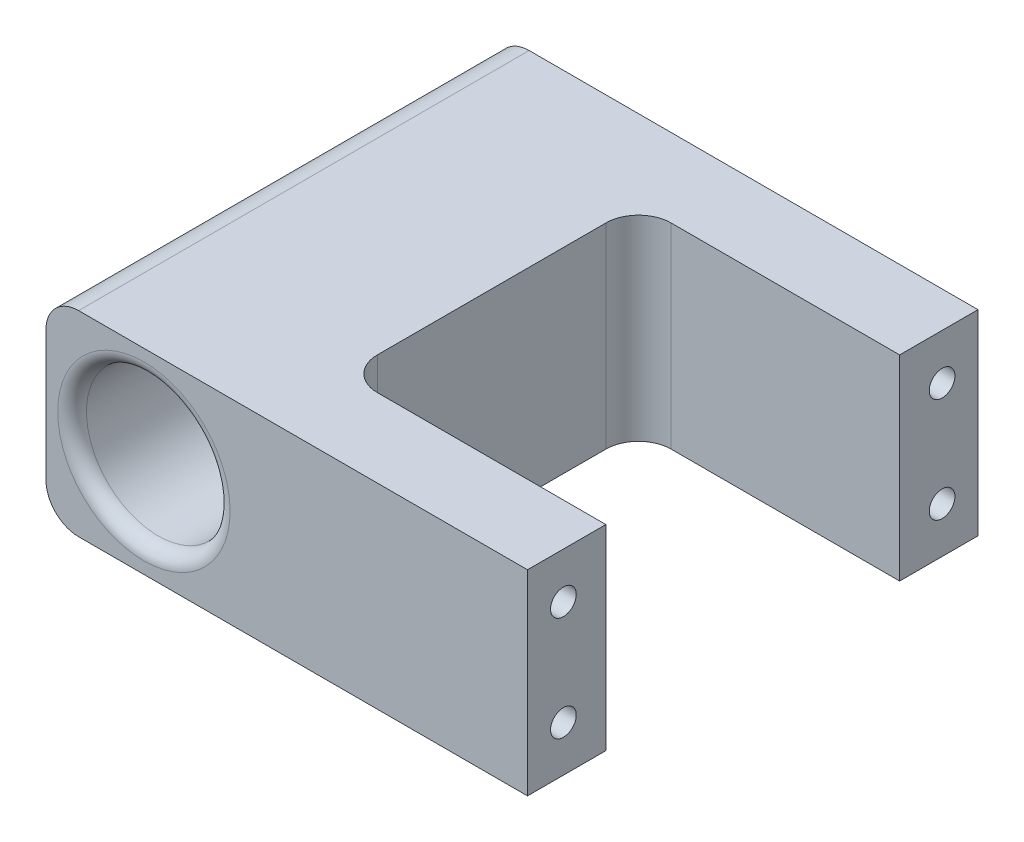
ISO-10303-21;
HEADER;
FILE_DESCRIPTION(('STEP AP214'),'2;1');
FILE_NAME('part.step','',(''),(''),'','','');
FILE_SCHEMA(('AUTOMOTIVE_DESIGN { 1 0 10303 214 1 1 1 1 }'));
ENDSEC;
DATA;
#1=APPLICATION_CONTEXT('core data for automotive mechanical design processes');
#2=APPLICATION_PROTOCOL_DEFINITION('international standard','automotive_design',2000,#1);
#3=PRODUCT_CONTEXT('',#1,'mechanical');
#4=PRODUCT('Part','Part','',(#3));
#5=PRODUCT_RELATED_PRODUCT_CATEGORY('part','',(#4));
#6=PRODUCT_DEFINITION_FORMATION('','',#4);
#7=PRODUCT_DEFINITION_CONTEXT('part definition',#1,'design');
#8=PRODUCT_DEFINITION('design','',#6,#7);
#9=PRODUCT_DEFINITION_SHAPE('','',#8);
#10=(LENGTH_UNIT() NAMED_UNIT(*) SI_UNIT(.MILLI.,.METRE.));
#11=(NAMED_UNIT(*) PLANE_ANGLE_UNIT() SI_UNIT($,.RADIAN.));
#12=(NAMED_UNIT(*) SI_UNIT($,.STERADIAN.) SOLID_ANGLE_UNIT());
#13=UNCERTAINTY_MEASURE_WITH_UNIT(LENGTH_MEASURE(1.E-05),#10,'distance_accuracy_value','');
#14=(GEOMETRIC_REPRESENTATION_CONTEXT(3) GLOBAL_UNCERTAINTY_ASSIGNED_CONTEXT((#13)) GLOBAL_UNIT_ASSIGNED_CONTEXT((#10,
#11,#12)) REPRESENTATION_CONTEXT('',''));
#15=CARTESIAN_POINT('',(0.,0.,0.));
#16=DIRECTION('',(0.,0.,1.));
#17=DIRECTION('',(1.,0.,0.));
#18=AXIS2_PLACEMENT_3D('',#15,#16,#17);
#19=CARTESIAN_POINT('',(74.609999878,-19.05,87.63));
#20=DIRECTION('',(0.,1.,0.));
#21=DIRECTION('',(-1.,0.,0.));
#22=AXIS2_PLACEMENT_3D('',#19,#20,#21);
#23=PLANE('',#22);
#24=DIRECTION('',(1.,0.,0.));
#25=VECTOR('',#24,1.);
#26=CARTESIAN_POINT('',(-19.05,-19.05,87.63));
#27=LINE('',#26,#25);
#28=CARTESIAN_POINT('',(-12.7,-19.05,87.63));
#29=VERTEX_POINT('',#28);
#30=CARTESIAN_POINT('',(74.609999878,-19.05,87.63));
#31=VERTEX_POINT('',#30);
#32=EDGE_CURVE('E177',#29,#31,#27,.T.);
#33=ORIENTED_EDGE('',*,*,#32,.F.);
#34=DIRECTION('',(0.,0.,-1.));
#35=VECTOR('',#34,1.);
#36=CARTESIAN_POINT('',(-12.7,-19.05,87.63));
#37=LINE('',#36,#35);
#38=CARTESIAN_POINT('',(-12.7,-19.05,0.));
#39=VERTEX_POINT('',#38);
#40=EDGE_CURVE('E214',#29,#39,#37,.T.);
#41=ORIENTED_EDGE('',*,*,#40,.T.);
#42=DIRECTION('',(1.,0.,0.));
#43=VECTOR('',#42,1.);
#44=CARTESIAN_POINT('',(74.609999878,-19.05,0.));
#45=LINE('',#44,#43);
#46=CARTESIAN_POINT('',(74.609999878,-19.05,0.));
#47=VERTEX_POINT('',#46);
#48=EDGE_CURVE('E243',#39,#47,#45,.T.);
#49=ORIENTED_EDGE('',*,*,#48,.T.);
#50=DIRECTION('',(0.,0.,-1.));
#51=VECTOR('',#50,1.);
#52=CARTESIAN_POINT('',(74.609999878,-19.05,87.63));
#53=LINE('',#52,#51);
#54=CARTESIAN_POINT('',(74.609999878,-19.05,15.24));
#55=VERTEX_POINT('',#54);
#56=EDGE_CURVE('E175',#55,#47,#53,.T.);
#57=ORIENTED_EDGE('',*,*,#56,.F.);
#58=DIRECTION('',(1.,0.,0.));
#59=VECTOR('',#58,1.);
#60=CARTESIAN_POINT('',(23.809999878,-19.05,15.24));
#61=LINE('',#60,#59);
#62=CARTESIAN_POINT('',(30.159999878,-19.05,15.24));
#63=VERTEX_POINT('',#62);
#64=EDGE_CURVE('E156',#63,#55,#61,.T.);
#65=ORIENTED_EDGE('',*,*,#64,.F.);
#66=CARTESIAN_POINT('',(30.159999878,-19.05,21.59));
#67=DIRECTION('',(0.,1.,0.));
#68=DIRECTION('',(-1.,0.,0.));
#69=AXIS2_PLACEMENT_3D('',#66,#67,#68);
#70=CIRCLE('',#69,6.35);
#71=CARTESIAN_POINT('',(23.809999878,-19.05,21.59));
#72=VERTEX_POINT('',#71);
#73=EDGE_CURVE('E207',#63,#72,#70,.T.);
#74=ORIENTED_EDGE('',*,*,#73,.T.);
#75=DIRECTION('',(0.,0.,1.));
#76=VECTOR('',#75,1.);
#77=CARTESIAN_POINT('',(23.809999878,-19.05,15.24));
#78=LINE('',#77,#76);
#79=CARTESIAN_POINT('',(23.809999878,-19.05,66.04));
#80=VERTEX_POINT('',#79);
#81=EDGE_CURVE('E281',#72,#80,#78,.T.);
#82=ORIENTED_EDGE('',*,*,#81,.T.);
#83=CARTESIAN_POINT('',(30.159999878,-19.05,66.04));
#84=DIRECTION('',(0.,1.,0.));
#85=DIRECTION('',(-1.,0.,0.));
#86=AXIS2_PLACEMENT_3D('',#83,#84,#85);
#87=CIRCLE('',#86,6.35);
#88=CARTESIAN_POINT('',(30.159999878,-19.05,72.39));
#89=VERTEX_POINT('',#88);
#90=EDGE_CURVE('E212',#80,#89,#87,.T.);
#91=ORIENTED_EDGE('',*,*,#90,.T.);
#92=DIRECTION('',(1.,0.,0.));
#93=VECTOR('',#92,1.);
#94=CARTESIAN_POINT('',(23.809999878,-19.05,72.39));
#95=LINE('',#94,#93);
#96=CARTESIAN_POINT('',(74.609999878,-19.05,72.39));
#97=VERTEX_POINT('',#96);
#98=EDGE_CURVE('E277',#89,#97,#95,.T.);
#99=ORIENTED_EDGE('',*,*,#98,.T.);
#100=EDGE_CURVE('E183',#31,#97,#53,.T.);
#101=ORIENTED_EDGE('',*,*,#100,.F.);
#102=EDGE_LOOP('',(#33,#41,#49,#57,#65,#74,#82,#91,#99,#101));
#103=FACE_BOUND('',#102,.T.);
#104=ADVANCED_FACE('F43',(#103),#23,.F.);
#105=CARTESIAN_POINT('',(74.609999878,19.05,87.63));
#106=DIRECTION('',(-1.,0.,0.));
#107=DIRECTION('',(0.,0.,1.));
#108=AXIS2_PLACEMENT_3D('',#105,#106,#107);
#109=PLANE('',#108);
#110=CARTESIAN_POINT('',(74.609999878,-10.16,6.985));
#111=DIRECTION('',(1.,0.,0.));
#112=DIRECTION('',(0.,0.,-1.));
#113=AXIS2_PLACEMENT_3D('',#110,#111,#112);
#114=CIRCLE('',#113,2.5);
#115=CARTESIAN_POINT('',(74.609999878,-10.16,4.48500000000001));
#116=VERTEX_POINT('',#115);
#117=EDGE_CURVE('E268',#116,#116,#114,.T.);
#118=ORIENTED_EDGE('',*,*,#117,.F.);
#119=EDGE_LOOP('',(#118));
#120=FACE_BOUND('',#119,.T.);
#121=CARTESIAN_POINT('',(74.609999878,10.16,6.985));
#122=DIRECTION('',(1.,0.,0.));
#123=DIRECTION('',(0.,0.,-1.));
#124=AXIS2_PLACEMENT_3D('',#121,#122,#123);
#125=CIRCLE('',#124,2.5);
#126=CARTESIAN_POINT('',(74.609999878,10.16,4.48500000000001));
#127=VERTEX_POINT('',#126);
#128=EDGE_CURVE('E155',#127,#127,#125,.T.);
#129=ORIENTED_EDGE('',*,*,#128,.F.);
#130=EDGE_LOOP('',(#129));
#131=FACE_BOUND('',#130,.T.);
#132=DIRECTION('',(0.,-1.,0.));
#133=VECTOR('',#132,1.);
#134=CARTESIAN_POINT('',(74.609999878,19.05,15.24));
#135=LINE('',#134,#133);
#136=CARTESIAN_POINT('',(74.609999878,19.05,15.24));
#137=VERTEX_POINT('',#136);
#138=EDGE_CURVE('E159',#137,#55,#135,.T.);
#139=ORIENTED_EDGE('',*,*,#138,.T.);
#140=ORIENTED_EDGE('',*,*,#56,.T.);
#141=DIRECTION('',(0.,1.,0.));
#142=VECTOR('',#141,1.);
#143=CARTESIAN_POINT('',(74.609999878,19.05,0.));
#144=LINE('',#143,#142);
#145=CARTESIAN_POINT('',(74.609999878,19.05,0.));
#146=VERTEX_POINT('',#145);
#147=EDGE_CURVE('E169',#47,#146,#144,.T.);
#148=ORIENTED_EDGE('',*,*,#147,.T.);
#149=DIRECTION('',(0.,0.,-1.));
#150=VECTOR('',#149,1.);
#151=CARTESIAN_POINT('',(74.609999878,19.05,87.63));
#152=LINE('',#151,#150);
#153=EDGE_CURVE('E147',#137,#146,#152,.T.);
#154=ORIENTED_EDGE('',*,*,#153,.F.);
#155=EDGE_LOOP('',(#139,#140,#148,#154));
#156=FACE_BOUND('',#155,.T.);
#157=ADVANCED_FACE('F167',(#120,#131,#156),#109,.F.);
#158=CARTESIAN_POINT('',(74.609999878,-10.16,80.645));
#159=DIRECTION('',(1.,0.,0.));
#160=DIRECTION('',(0.,0.,-1.));
#161=AXIS2_PLACEMENT_3D('',#158,#159,#160);
#162=CIRCLE('',#161,2.5);
#163=CARTESIAN_POINT('',(74.609999878,-10.16,78.145));
#164=VERTEX_POINT('',#163);
#165=EDGE_CURVE('E250',#164,#164,#162,.T.);
#166=ORIENTED_EDGE('',*,*,#165,.F.);
#167=EDGE_LOOP('',(#166));
#168=FACE_BOUND('',#167,.T.);
#169=CARTESIAN_POINT('',(74.609999878,10.16,80.645));
#170=DIRECTION('',(1.,0.,0.));
#171=DIRECTION('',(0.,0.,-1.));
#172=AXIS2_PLACEMENT_3D('',#169,#170,#171);
#173=CIRCLE('',#172,2.5);
#174=CARTESIAN_POINT('',(74.609999878,10.16,78.145));
#175=VERTEX_POINT('',#174);
#176=EDGE_CURVE('E262',#175,#175,#173,.T.);
#177=ORIENTED_EDGE('',*,*,#176,.F.);
#178=EDGE_LOOP('',(#177));
#179=FACE_BOUND('',#178,.T.);
#180=DIRECTION('',(0.,1.,0.));
#181=VECTOR('',#180,1.);
#182=CARTESIAN_POINT('',(74.609999878,-19.05,72.39));
#183=LINE('',#182,#181);
#184=CARTESIAN_POINT('',(74.609999878,19.05,72.39));
#185=VERTEX_POINT('',#184);
#186=EDGE_CURVE('E165',#97,#185,#183,.T.);
#187=ORIENTED_EDGE('',*,*,#186,.T.);
#188=CARTESIAN_POINT('',(74.609999878,19.05,87.63));
#189=VERTEX_POINT('',#188);
#190=EDGE_CURVE('E171',#189,#185,#152,.T.);
#191=ORIENTED_EDGE('',*,*,#190,.F.);
#192=DIRECTION('',(0.,1.,0.));
#193=VECTOR('',#192,1.);
#194=CARTESIAN_POINT('',(74.609999878,19.05,87.63));
#195=LINE('',#194,#193);
#196=EDGE_CURVE('E172',#31,#189,#195,.T.);
#197=ORIENTED_EDGE('',*,*,#196,.F.);
#198=ORIENTED_EDGE('',*,*,#100,.T.);
#199=EDGE_LOOP('',(#187,#191,#197,#198));
#200=FACE_BOUND('',#199,.T.);
#201=ADVANCED_FACE('F308',(#168,#179,#200),#109,.F.);
#202=CARTESIAN_POINT('',(0.,19.05,87.63));
#203=DIRECTION('',(0.,-1.,0.));
#204=DIRECTION('',(1.,0.,0.));
#205=AXIS2_PLACEMENT_3D('',#202,#203,#204);
#206=PLANE('',#205);
#207=DIRECTION('',(-1.,0.,0.));
#208=VECTOR('',#207,1.);
#209=CARTESIAN_POINT('',(0.,19.05,0.));
#210=LINE('',#209,#208);
#211=CARTESIAN_POINT('',(-12.7,19.05,0.));
#212=VERTEX_POINT('',#211);
#213=EDGE_CURVE('E181',#146,#212,#210,.T.);
#214=ORIENTED_EDGE('',*,*,#213,.T.);
#215=DIRECTION('',(0.,0.,-1.));
#216=VECTOR('',#215,1.);
#217=CARTESIAN_POINT('',(-12.7,19.05,87.63));
#218=LINE('',#217,#216);
#219=CARTESIAN_POINT('',(-12.7,19.05,87.63));
#220=VERTEX_POINT('',#219);
#221=EDGE_CURVE('E11',#212,#220,#218,.F.);
#222=ORIENTED_EDGE('',*,*,#221,.T.);
#223=DIRECTION('',(-1.,0.,0.));
#224=VECTOR('',#223,1.);
#225=CARTESIAN_POINT('',(0.,19.05,87.63));
#226=LINE('',#225,#224);
#227=EDGE_CURVE('E252',#189,#220,#226,.T.);
#228=ORIENTED_EDGE('',*,*,#227,.F.);
#229=ORIENTED_EDGE('',*,*,#190,.T.);
#230=DIRECTION('',(1.,0.,0.));
#231=VECTOR('',#230,1.);
#232=CARTESIAN_POINT('',(23.809999878,19.05,72.39));
#233=LINE('',#232,#231);
#234=CARTESIAN_POINT('',(30.159999878,19.05,72.39));
#235=VERTEX_POINT('',#234);
#236=EDGE_CURVE('E279',#235,#185,#233,.T.);
#237=ORIENTED_EDGE('',*,*,#236,.F.);
#238=CARTESIAN_POINT('',(30.159999878,19.05,66.04));
#239=DIRECTION('',(0.,-1.,0.));
#240=DIRECTION('',(1.,0.,0.));
#241=AXIS2_PLACEMENT_3D('',#238,#239,#240);
#242=CIRCLE('',#241,6.35);
#243=CARTESIAN_POINT('',(23.809999878,19.05,66.04));
#244=VERTEX_POINT('',#243);
#245=EDGE_CURVE('E210',#235,#244,#242,.T.);
#246=ORIENTED_EDGE('',*,*,#245,.T.);
#247=DIRECTION('',(0.,0.,-1.));
#248=VECTOR('',#247,1.);
#249=CARTESIAN_POINT('',(23.809999878,19.05,72.39));
#250=LINE('',#249,#248);
#251=CARTESIAN_POINT('',(23.809999878,19.05,21.59));
#252=VERTEX_POINT('',#251);
#253=EDGE_CURVE('E283',#244,#252,#250,.T.);
#254=ORIENTED_EDGE('',*,*,#253,.T.);
#255=CARTESIAN_POINT('',(30.159999878,19.05,21.59));
#256=DIRECTION('',(0.,-1.,0.));
#257=DIRECTION('',(1.,0.,0.));
#258=AXIS2_PLACEMENT_3D('',#255,#256,#257);
#259=CIRCLE('',#258,6.35);
#260=CARTESIAN_POINT('',(30.159999878,19.05,15.24));
#261=VERTEX_POINT('',#260);
#262=EDGE_CURVE('E151',#252,#261,#259,.T.);
#263=ORIENTED_EDGE('',*,*,#262,.T.);
#264=DIRECTION('',(1.,0.,0.));
#265=VECTOR('',#264,1.);
#266=CARTESIAN_POINT('',(23.809999878,19.05,15.24));
#267=LINE('',#266,#265);
#268=EDGE_CURVE('E143',#261,#137,#267,.T.);
#269=ORIENTED_EDGE('',*,*,#268,.T.);
#270=ORIENTED_EDGE('',*,*,#153,.T.);
#271=EDGE_LOOP('',(#214,#222,#228,#229,#237,#246,#254,#263,#269,#270));
#272=FACE_BOUND('',#271,.T.);
#273=ADVANCED_FACE('F145',(#272),#206,.F.);
#274=CARTESIAN_POINT('',(0.,0.,87.63));
#275=DIRECTION('',(0.,0.,1.));
#276=DIRECTION('',(1.,0.,0.));
#277=AXIS2_PLACEMENT_3D('',#274,#275,#276);
#278=PLANE('',#277);
#279=CARTESIAN_POINT('',(0.,0.,87.63));
#280=DIRECTION('',(0.,0.,1.));
#281=DIRECTION('',(1.,0.,0.));
#282=AXIS2_PLACEMENT_3D('',#279,#280,#281);
#283=CIRCLE('',#282,16.764);
#284=CARTESIAN_POINT('',(16.764,0.,87.63));
#285=VERTEX_POINT('',#284);
#286=EDGE_CURVE('E192',#285,#285,#283,.F.);
#287=ORIENTED_EDGE('',*,*,#286,.T.);
#288=EDGE_LOOP('',(#287));
#289=FACE_BOUND('',#288,.T.);
#290=DIRECTION('',(0.,-1.,0.));
#291=VECTOR('',#290,1.);
#292=CARTESIAN_POINT('',(-19.05,19.05,87.63));
#293=LINE('',#292,#291);
#294=CARTESIAN_POINT('',(-19.05,12.7,87.63));
#295=VERTEX_POINT('',#294);
#296=CARTESIAN_POINT('',(-19.05,-12.7,87.63));
#297=VERTEX_POINT('',#296);
#298=EDGE_CURVE('E231',#295,#297,#293,.T.);
#299=ORIENTED_EDGE('',*,*,#298,.T.);
#300=CARTESIAN_POINT('',(-12.7,-12.7,87.63));
#301=DIRECTION('',(0.,0.,1.));
#302=DIRECTION('',(1.,0.,0.));
#303=AXIS2_PLACEMENT_3D('',#300,#301,#302);
#304=CIRCLE('',#303,6.35);
#305=EDGE_CURVE('E51',#297,#29,#304,.T.);
#306=ORIENTED_EDGE('',*,*,#305,.T.);
#307=ORIENTED_EDGE('',*,*,#32,.T.);
#308=ORIENTED_EDGE('',*,*,#196,.T.);
#309=ORIENTED_EDGE('',*,*,#227,.T.);
#310=CARTESIAN_POINT('',(-12.7,12.7,87.63));
#311=DIRECTION('',(0.,0.,1.));
#312=DIRECTION('',(1.,0.,0.));
#313=AXIS2_PLACEMENT_3D('',#310,#311,#312);
#314=CIRCLE('',#313,6.35);
#315=EDGE_CURVE('E225',#220,#295,#314,.T.);
#316=ORIENTED_EDGE('',*,*,#315,.T.);
#317=EDGE_LOOP('',(#299,#306,#307,#308,#309,#316));
#318=FACE_BOUND('',#317,.T.);
#319=ADVANCED_FACE('F229',(#289,#318),#278,.T.);
#320=CARTESIAN_POINT('',(0.,0.,0.));
#321=DIRECTION('',(0.,0.,1.));
#322=DIRECTION('',(1.,0.,0.));
#323=AXIS2_PLACEMENT_3D('',#320,#321,#322);
#324=PLANE('',#323);
#325=CARTESIAN_POINT('',(0.,0.,0.));
#326=DIRECTION('',(0.,0.,1.));
#327=DIRECTION('',(1.,0.,0.));
#328=AXIS2_PLACEMENT_3D('',#325,#326,#327);
#329=CIRCLE('',#328,16.764);
#330=CARTESIAN_POINT('',(16.764,0.,0.));
#331=VERTEX_POINT('',#330);
#332=EDGE_CURVE('E195',#331,#331,#329,.T.);
#333=ORIENTED_EDGE('',*,*,#332,.T.);
#334=EDGE_LOOP('',(#333));
#335=FACE_BOUND('',#334,.T.);
#336=ORIENTED_EDGE('',*,*,#48,.F.);
#337=CARTESIAN_POINT('',(-12.7,-12.7,0.));
#338=DIRECTION('',(0.,0.,1.));
#339=DIRECTION('',(1.,0.,0.));
#340=AXIS2_PLACEMENT_3D('',#337,#338,#339);
#341=CIRCLE('',#340,6.35);
#342=CARTESIAN_POINT('',(-19.05,-12.7,0.));
#343=VERTEX_POINT('',#342);
#344=EDGE_CURVE('E219',#39,#343,#341,.F.);
#345=ORIENTED_EDGE('',*,*,#344,.T.);
#346=DIRECTION('',(0.,-1.,0.));
#347=VECTOR('',#346,1.);
#348=CARTESIAN_POINT('',(-19.05,19.05,0.));
#349=LINE('',#348,#347);
#350=CARTESIAN_POINT('',(-19.05,12.7,0.));
#351=VERTEX_POINT('',#350);
#352=EDGE_CURVE('E242',#351,#343,#349,.T.);
#353=ORIENTED_EDGE('',*,*,#352,.F.);
#354=CARTESIAN_POINT('',(-12.7,12.7,0.));
#355=DIRECTION('',(0.,0.,1.));
#356=DIRECTION('',(1.,0.,0.));
#357=AXIS2_PLACEMENT_3D('',#354,#355,#356);
#358=CIRCLE('',#357,6.35);
#359=EDGE_CURVE('E217',#351,#212,#358,.F.);
#360=ORIENTED_EDGE('',*,*,#359,.T.);
#361=ORIENTED_EDGE('',*,*,#213,.F.);
#362=ORIENTED_EDGE('',*,*,#147,.F.);
#363=EDGE_LOOP('',(#336,#345,#353,#360,#361,#362));
#364=FACE_BOUND('',#363,.T.);
#365=ADVANCED_FACE('F241',(#335,#364),#324,.F.);
#366=CARTESIAN_POINT('',(-19.05,19.05,87.63));
#367=DIRECTION('',(1.,0.,0.));
#368=DIRECTION('',(0.,0.,-1.));
#369=AXIS2_PLACEMENT_3D('',#366,#367,#368);
#370=PLANE('',#369);
#371=ORIENTED_EDGE('',*,*,#352,.T.);
#372=DIRECTION('',(0.,0.,-1.));
#373=VECTOR('',#372,1.);
#374=CARTESIAN_POINT('',(-19.05,-12.7,87.63));
#375=LINE('',#374,#373);
#376=EDGE_CURVE('E64',#343,#297,#375,.F.);
#377=ORIENTED_EDGE('',*,*,#376,.T.);
#378=ORIENTED_EDGE('',*,*,#298,.F.);
#379=DIRECTION('',(0.,0.,-1.));
#380=VECTOR('',#379,1.);
#381=CARTESIAN_POINT('',(-19.05,12.7,87.63));
#382=LINE('',#381,#380);
#383=EDGE_CURVE('E221',#295,#351,#382,.T.);
#384=ORIENTED_EDGE('',*,*,#383,.T.);
#385=EDGE_LOOP('',(#371,#377,#378,#384));
#386=FACE_BOUND('',#385,.T.);
#387=ADVANCED_FACE('F244',(#386),#370,.F.);
#388=CARTESIAN_POINT('',(0.,0.,87.63));
#389=DIRECTION('',(0.,0.,-1.));
#390=DIRECTION('',(-1.,0.,0.));
#391=AXIS2_PLACEMENT_3D('',#388,#389,#390);
#392=CYLINDRICAL_SURFACE('',#391,13.97);
#393=CARTESIAN_POINT('',(0.,0.,84.836));
#394=DIRECTION('',(0.,0.,1.));
#395=DIRECTION('',(1.,0.,0.));
#396=AXIS2_PLACEMENT_3D('',#393,#394,#395);
#397=CIRCLE('',#396,13.97);
#398=CARTESIAN_POINT('',(13.97,0.,84.836));
#399=VERTEX_POINT('',#398);
#400=EDGE_CURVE('E189',#399,#399,#397,.T.);
#401=ORIENTED_EDGE('',*,*,#400,.T.);
#402=EDGE_LOOP('',(#401));
#403=FACE_BOUND('',#402,.T.);
#404=CARTESIAN_POINT('',(0.,0.,2.794));
#405=DIRECTION('',(0.,0.,1.));
#406=DIRECTION('',(1.,0.,0.));
#407=AXIS2_PLACEMENT_3D('',#404,#405,#406);
#408=CIRCLE('',#407,13.97);
#409=CARTESIAN_POINT('',(13.97,0.,2.794));
#410=VERTEX_POINT('',#409);
#411=EDGE_CURVE('E186',#410,#410,#408,.F.);
#412=ORIENTED_EDGE('',*,*,#411,.T.);
#413=EDGE_LOOP('',(#412));
#414=FACE_BOUND('',#413,.T.);
#415=ADVANCED_FACE('F315',(#403,#414),#392,.F.);
#416=CARTESIAN_POINT('',(0.,0.,84.836));
#417=DIRECTION('',(0.,0.,1.));
#418=DIRECTION('',(1.,0.,0.));
#419=AXIS2_PLACEMENT_3D('',#416,#417,#418);
#420=TOROIDAL_SURFACE('',#419,16.764,2.794);
#421=ORIENTED_EDGE('',*,*,#286,.F.);
#422=EDGE_LOOP('',(#421));
#423=FACE_BOUND('',#422,.T.);
#424=ORIENTED_EDGE('',*,*,#400,.F.);
#425=EDGE_LOOP('',(#424));
#426=FACE_BOUND('',#425,.T.);
#427=ADVANCED_FACE('F316',(#423,#426),#420,.T.);
#428=CARTESIAN_POINT('',(0.,0.,2.794));
#429=DIRECTION('',(0.,0.,1.));
#430=DIRECTION('',(1.,0.,0.));
#431=AXIS2_PLACEMENT_3D('',#428,#429,#430);
#432=TOROIDAL_SURFACE('',#431,16.764,2.794);
#433=ORIENTED_EDGE('',*,*,#411,.F.);
#434=EDGE_LOOP('',(#433));
#435=FACE_BOUND('',#434,.T.);
#436=ORIENTED_EDGE('',*,*,#332,.F.);
#437=EDGE_LOOP('',(#436));
#438=FACE_BOUND('',#437,.T.);
#439=ADVANCED_FACE('F319',(#435,#438),#432,.T.);
#440=CARTESIAN_POINT('',(33.461999878,-10.16,80.645));
#441=DIRECTION('',(1.,0.,0.));
#442=DIRECTION('',(0.,0.,-1.));
#443=AXIS2_PLACEMENT_3D('',#440,#441,#442);
#444=CONICAL_SURFACE('',#443,2.49999999999999,1.02974425867665);
#445=CARTESIAN_POINT('',(31.9598483304311,-10.16,80.645));
#446=VERTEX_POINT('',#445);
#447=VERTEX_LOOP('',#446);
#448=FACE_BOUND('',#447,.T.);
#449=CARTESIAN_POINT('',(33.461999878,-10.16,80.645));
#450=DIRECTION('',(1.,0.,0.));
#451=DIRECTION('',(0.,0.,-1.));
#452=AXIS2_PLACEMENT_3D('',#449,#450,#451);
#453=CIRCLE('',#452,2.49999999999999);
#454=CARTESIAN_POINT('',(33.461999878,-10.16,78.145));
#455=VERTEX_POINT('',#454);
#456=EDGE_CURVE('E246',#455,#455,#453,.T.);
#457=ORIENTED_EDGE('',*,*,#456,.T.);
#458=EDGE_LOOP('',(#457));
#459=FACE_BOUND('',#458,.T.);
#460=ADVANCED_FACE('F323',(#448,#459),#444,.F.);
#461=CARTESIAN_POINT('',(74.609999878,-10.16,80.645));
#462=DIRECTION('',(1.,0.,0.));
#463=DIRECTION('',(0.,0.,-1.));
#464=AXIS2_PLACEMENT_3D('',#461,#462,#463);
#465=CYLINDRICAL_SURFACE('',#464,2.49999999999999);
#466=ORIENTED_EDGE('',*,*,#456,.F.);
#467=EDGE_LOOP('',(#466));
#468=FACE_BOUND('',#467,.T.);
#469=ORIENTED_EDGE('',*,*,#165,.T.);
#470=EDGE_LOOP('',(#469));
#471=FACE_BOUND('',#470,.T.);
#472=ADVANCED_FACE('F361',(#468,#471),#465,.F.);
#473=CARTESIAN_POINT('',(33.461999878,10.16,80.645));
#474=DIRECTION('',(1.,0.,0.));
#475=DIRECTION('',(0.,0.,-1.));
#476=AXIS2_PLACEMENT_3D('',#473,#474,#475);
#477=CONICAL_SURFACE('',#476,2.49999999999999,1.02974425867665);
#478=CARTESIAN_POINT('',(31.9598483304311,10.16,80.645));
#479=VERTEX_POINT('',#478);
#480=VERTEX_LOOP('',#479);
#481=FACE_BOUND('',#480,.T.);
#482=CARTESIAN_POINT('',(33.461999878,10.16,80.645));
#483=DIRECTION('',(1.,0.,0.));
#484=DIRECTION('',(0.,0.,-1.));
#485=AXIS2_PLACEMENT_3D('',#482,#483,#484);
#486=CIRCLE('',#485,2.49999999999999);
#487=CARTESIAN_POINT('',(33.461999878,10.16,78.145));
#488=VERTEX_POINT('',#487);
#489=EDGE_CURVE('E259',#488,#488,#486,.T.);
#490=ORIENTED_EDGE('',*,*,#489,.T.);
#491=EDGE_LOOP('',(#490));
#492=FACE_BOUND('',#491,.T.);
#493=ADVANCED_FACE('F351',(#481,#492),#477,.F.);
#494=CARTESIAN_POINT('',(74.609999878,10.16,80.645));
#495=DIRECTION('',(1.,0.,0.));
#496=DIRECTION('',(0.,0.,-1.));
#497=AXIS2_PLACEMENT_3D('',#494,#495,#496);
#498=CYLINDRICAL_SURFACE('',#497,2.49999999999999);
#499=ORIENTED_EDGE('',*,*,#489,.F.);
#500=EDGE_LOOP('',(#499));
#501=FACE_BOUND('',#500,.T.);
#502=ORIENTED_EDGE('',*,*,#176,.T.);
#503=EDGE_LOOP('',(#502));
#504=FACE_BOUND('',#503,.T.);
#505=ADVANCED_FACE('F348',(#501,#504),#498,.F.);
#506=CARTESIAN_POINT('',(33.461999878,-10.16,6.985));
#507=DIRECTION('',(1.,0.,0.));
#508=DIRECTION('',(0.,0.,-1.));
#509=AXIS2_PLACEMENT_3D('',#506,#507,#508);
#510=CONICAL_SURFACE('',#509,2.49999999999999,1.02974425867665);
#511=CARTESIAN_POINT('',(31.9598483304311,-10.16,6.985));
#512=VERTEX_POINT('',#511);
#513=VERTEX_LOOP('',#512);
#514=FACE_BOUND('',#513,.T.);
#515=CARTESIAN_POINT('',(33.461999878,-10.16,6.985));
#516=DIRECTION('',(1.,0.,0.));
#517=DIRECTION('',(0.,0.,-1.));
#518=AXIS2_PLACEMENT_3D('',#515,#516,#517);
#519=CIRCLE('',#518,2.49999999999999);
#520=CARTESIAN_POINT('',(33.461999878,-10.16,4.48500000000001));
#521=VERTEX_POINT('',#520);
#522=EDGE_CURVE('E265',#521,#521,#519,.T.);
#523=ORIENTED_EDGE('',*,*,#522,.T.);
#524=EDGE_LOOP('',(#523));
#525=FACE_BOUND('',#524,.T.);
#526=ADVANCED_FACE('F350',(#514,#525),#510,.F.);
#527=CARTESIAN_POINT('',(74.609999878,-10.16,6.985));
#528=DIRECTION('',(1.,0.,0.));
#529=DIRECTION('',(0.,0.,-1.));
#530=AXIS2_PLACEMENT_3D('',#527,#528,#529);
#531=CYLINDRICAL_SURFACE('',#530,2.49999999999999);
#532=ORIENTED_EDGE('',*,*,#522,.F.);
#533=EDGE_LOOP('',(#532));
#534=FACE_BOUND('',#533,.T.);
#535=ORIENTED_EDGE('',*,*,#117,.T.);
#536=EDGE_LOOP('',(#535));
#537=FACE_BOUND('',#536,.T.);
#538=ADVANCED_FACE('F358',(#534,#537),#531,.F.);
#539=CARTESIAN_POINT('',(33.461999878,10.16,6.985));
#540=DIRECTION('',(1.,0.,0.));
#541=DIRECTION('',(0.,0.,-1.));
#542=AXIS2_PLACEMENT_3D('',#539,#540,#541);
#543=CONICAL_SURFACE('',#542,2.49999999999999,1.02974425867665);
#544=CARTESIAN_POINT('',(31.9598483304311,10.16,6.985));
#545=VERTEX_POINT('',#544);
#546=VERTEX_LOOP('',#545);
#547=FACE_BOUND('',#546,.T.);
#548=CARTESIAN_POINT('',(33.461999878,10.16,6.985));
#549=DIRECTION('',(1.,0.,0.));
#550=DIRECTION('',(0.,0.,-1.));
#551=AXIS2_PLACEMENT_3D('',#548,#549,#550);
#552=CIRCLE('',#551,2.49999999999999);
#553=CARTESIAN_POINT('',(33.461999878,10.16,4.48500000000001));
#554=VERTEX_POINT('',#553);
#555=EDGE_CURVE('E271',#554,#554,#552,.T.);
#556=ORIENTED_EDGE('',*,*,#555,.T.);
#557=EDGE_LOOP('',(#556));
#558=FACE_BOUND('',#557,.T.);
#559=ADVANCED_FACE('F469',(#547,#558),#543,.F.);
#560=CARTESIAN_POINT('',(74.609999878,10.16,6.985));
#561=DIRECTION('',(1.,0.,0.));
#562=DIRECTION('',(0.,0.,-1.));
#563=AXIS2_PLACEMENT_3D('',#560,#561,#562);
#564=CYLINDRICAL_SURFACE('',#563,2.49999999999999);
#565=ORIENTED_EDGE('',*,*,#555,.F.);
#566=EDGE_LOOP('',(#565));
#567=FACE_BOUND('',#566,.T.);
#568=ORIENTED_EDGE('',*,*,#128,.T.);
#569=EDGE_LOOP('',(#568));
#570=FACE_BOUND('',#569,.T.);
#571=ADVANCED_FACE('F437',(#567,#570),#564,.F.);
#572=CARTESIAN_POINT('',(23.809999878,19.05,15.24));
#573=DIRECTION('',(0.,0.,1.));
#574=DIRECTION('',(0.,-1.,0.));
#575=AXIS2_PLACEMENT_3D('',#572,#573,#574);
#576=PLANE('',#575);
#577=ORIENTED_EDGE('',*,*,#268,.F.);
#578=DIRECTION('',(0.,-1.,0.));
#579=VECTOR('',#578,1.);
#580=CARTESIAN_POINT('',(30.159999878,19.05,15.24));
#581=LINE('',#580,#579);
#582=EDGE_CURVE('E198',#261,#63,#581,.T.);
#583=ORIENTED_EDGE('',*,*,#582,.T.);
#584=ORIENTED_EDGE('',*,*,#64,.T.);
#585=ORIENTED_EDGE('',*,*,#138,.F.);
#586=EDGE_LOOP('',(#577,#583,#584,#585));
#587=FACE_BOUND('',#586,.T.);
#588=ADVANCED_FACE('F160',(#587),#576,.T.);
#589=CARTESIAN_POINT('',(23.809999878,-19.05,72.39));
#590=DIRECTION('',(0.,0.,-1.));
#591=DIRECTION('',(-1.,0.,0.));
#592=AXIS2_PLACEMENT_3D('',#589,#590,#591);
#593=PLANE('',#592);
#594=ORIENTED_EDGE('',*,*,#98,.F.);
#595=DIRECTION('',(0.,1.,0.));
#596=VECTOR('',#595,1.);
#597=CARTESIAN_POINT('',(30.159999878,-19.05,72.39));
#598=LINE('',#597,#596);
#599=EDGE_CURVE('E204',#89,#235,#598,.T.);
#600=ORIENTED_EDGE('',*,*,#599,.T.);
#601=ORIENTED_EDGE('',*,*,#236,.T.);
#602=ORIENTED_EDGE('',*,*,#186,.F.);
#603=EDGE_LOOP('',(#594,#600,#601,#602));
#604=FACE_BOUND('',#603,.T.);
#605=ADVANCED_FACE('F336',(#604),#593,.T.);
#606=CARTESIAN_POINT('',(23.809999878,0.,0.));
#607=DIRECTION('',(-1.,0.,0.));
#608=DIRECTION('',(0.,0.,1.));
#609=AXIS2_PLACEMENT_3D('',#606,#607,#608);
#610=PLANE('',#609);
#611=ORIENTED_EDGE('',*,*,#81,.F.);
#612=DIRECTION('',(0.,-1.,0.));
#613=VECTOR('',#612,1.);
#614=CARTESIAN_POINT('',(23.809999878,0.,21.59));
#615=LINE('',#614,#613);
#616=EDGE_CURVE('E202',#72,#252,#615,.F.);
#617=ORIENTED_EDGE('',*,*,#616,.T.);
#618=ORIENTED_EDGE('',*,*,#253,.F.);
#619=DIRECTION('',(0.,1.,0.));
#620=VECTOR('',#619,1.);
#621=CARTESIAN_POINT('',(23.809999878,0.,66.04));
#622=LINE('',#621,#620);
#623=EDGE_CURVE('E200',#244,#80,#622,.F.);
#624=ORIENTED_EDGE('',*,*,#623,.T.);
#625=EDGE_LOOP('',(#611,#617,#618,#624));
#626=FACE_BOUND('',#625,.T.);
#627=ADVANCED_FACE('F327',(#626),#610,.F.);
#628=CARTESIAN_POINT('',(30.159999878,19.05,21.59));
#629=DIRECTION('',(0.,-1.,0.));
#630=DIRECTION('',(0.,0.,-1.));
#631=AXIS2_PLACEMENT_3D('',#628,#629,#630);
#632=CYLINDRICAL_SURFACE('',#631,6.35);
#633=ORIENTED_EDGE('',*,*,#262,.F.);
#634=ORIENTED_EDGE('',*,*,#616,.F.);
#635=ORIENTED_EDGE('',*,*,#73,.F.);
#636=ORIENTED_EDGE('',*,*,#582,.F.);
#637=EDGE_LOOP('',(#633,#634,#635,#636));
#638=FACE_BOUND('',#637,.T.);
#639=ADVANCED_FACE('F293',(#638),#632,.F.);
#640=CARTESIAN_POINT('',(30.159999878,-19.05,66.04));
#641=DIRECTION('',(0.,1.,0.));
#642=DIRECTION('',(0.,0.,1.));
#643=AXIS2_PLACEMENT_3D('',#640,#641,#642);
#644=CYLINDRICAL_SURFACE('',#643,6.35);
#645=ORIENTED_EDGE('',*,*,#90,.F.);
#646=ORIENTED_EDGE('',*,*,#623,.F.);
#647=ORIENTED_EDGE('',*,*,#245,.F.);
#648=ORIENTED_EDGE('',*,*,#599,.F.);
#649=EDGE_LOOP('',(#645,#646,#647,#648));
#650=FACE_BOUND('',#649,.T.);
#651=ADVANCED_FACE('F300',(#650),#644,.F.);
#652=CARTESIAN_POINT('',(-12.7,-12.7,87.63));
#653=DIRECTION('',(0.,0.,-1.));
#654=DIRECTION('',(-1.,0.,0.));
#655=AXIS2_PLACEMENT_3D('',#652,#653,#654);
#656=CYLINDRICAL_SURFACE('',#655,6.35);
#657=ORIENTED_EDGE('',*,*,#305,.F.);
#658=ORIENTED_EDGE('',*,*,#376,.F.);
#659=ORIENTED_EDGE('',*,*,#344,.F.);
#660=ORIENTED_EDGE('',*,*,#40,.F.);
#661=EDGE_LOOP('',(#657,#658,#659,#660));
#662=FACE_BOUND('',#661,.T.);
#663=ADVANCED_FACE('F238',(#662),#656,.T.);
#664=CARTESIAN_POINT('',(-12.7,12.7,87.63));
#665=DIRECTION('',(0.,0.,-1.));
#666=DIRECTION('',(-1.,0.,0.));
#667=AXIS2_PLACEMENT_3D('',#664,#665,#666);
#668=CYLINDRICAL_SURFACE('',#667,6.35);
#669=ORIENTED_EDGE('',*,*,#315,.F.);
#670=ORIENTED_EDGE('',*,*,#221,.F.);
#671=ORIENTED_EDGE('',*,*,#359,.F.);
#672=ORIENTED_EDGE('',*,*,#383,.F.);
#673=EDGE_LOOP('',(#669,#670,#671,#672));
#674=FACE_BOUND('',#673,.T.);
#675=ADVANCED_FACE('F45',(#674),#668,.T.);
#676=CLOSED_SHELL('',(#104,#157,#201,#273,#319,#365,#387,#415,#427,#439,#460,#472,#493,#505,
#526,#538,#559,#571,#588,#605,#627,#639,#651,#663,#675));
#677=MANIFOLD_SOLID_BREP('B2',#676);
#678=ADVANCED_BREP_SHAPE_REPRESENTATION('',(#18,#677),#14);
#679=SHAPE_DEFINITION_REPRESENTATION(#9,#678);
ENDSEC;
END-ISO-10303-21;
